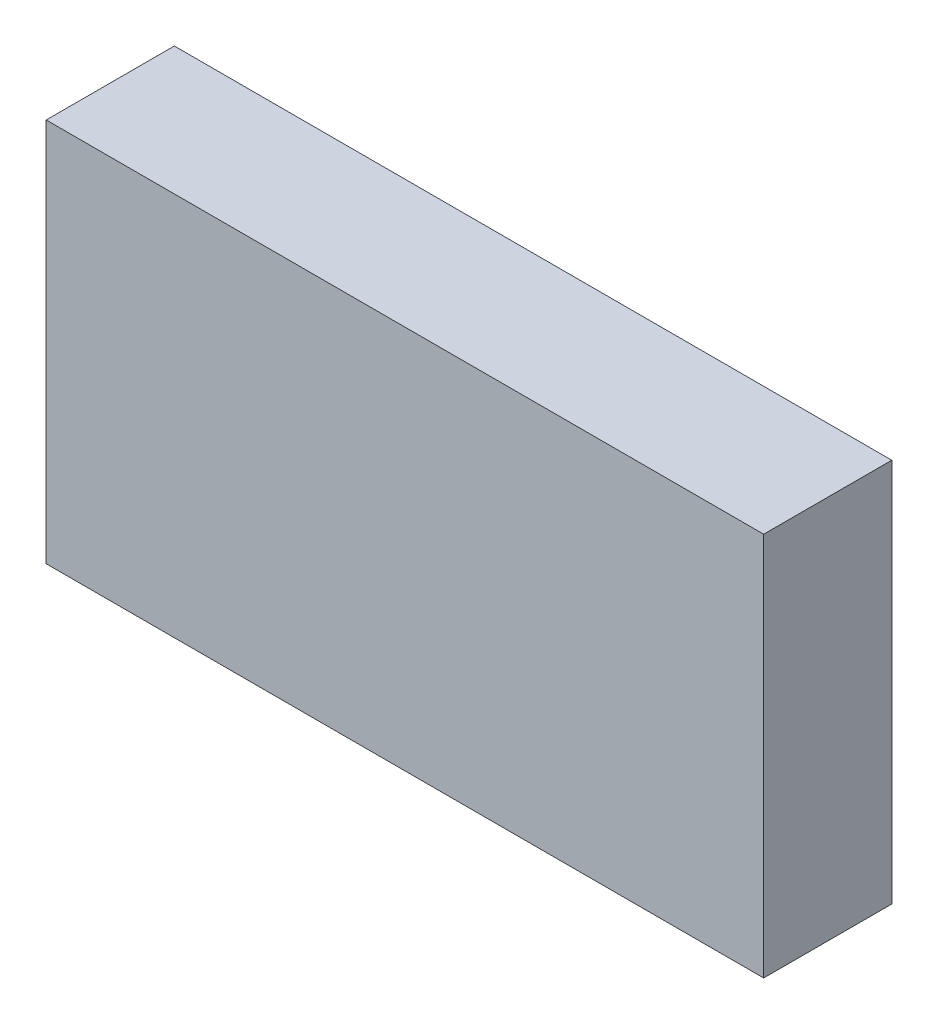
ISO-10303-21;
HEADER;
FILE_DESCRIPTION(('STEP AP214'),'2;1');
FILE_NAME('part.step','',(''),(''),'','','');
FILE_SCHEMA(('AUTOMOTIVE_DESIGN { 1 0 10303 214 1 1 1 1 }'));
ENDSEC;
DATA;
#1=APPLICATION_CONTEXT('core data for automotive mechanical design processes');
#2=APPLICATION_PROTOCOL_DEFINITION('international standard','automotive_design',2000,#1);
#3=PRODUCT_CONTEXT('',#1,'mechanical');
#4=PRODUCT('Part','Part','',(#3));
#5=PRODUCT_RELATED_PRODUCT_CATEGORY('part','',(#4));
#6=PRODUCT_DEFINITION_FORMATION('','',#4);
#7=PRODUCT_DEFINITION_CONTEXT('part definition',#1,'design');
#8=PRODUCT_DEFINITION('design','',#6,#7);
#9=PRODUCT_DEFINITION_SHAPE('','',#8);
#10=(LENGTH_UNIT() NAMED_UNIT(*) SI_UNIT(.MILLI.,.METRE.));
#11=(NAMED_UNIT(*) PLANE_ANGLE_UNIT() SI_UNIT($,.RADIAN.));
#12=(NAMED_UNIT(*) SI_UNIT($,.STERADIAN.) SOLID_ANGLE_UNIT());
#13=UNCERTAINTY_MEASURE_WITH_UNIT(LENGTH_MEASURE(1.E-05),#10,'distance_accuracy_value','');
#14=(GEOMETRIC_REPRESENTATION_CONTEXT(3) GLOBAL_UNCERTAINTY_ASSIGNED_CONTEXT((#13)) GLOBAL_UNIT_ASSIGNED_CONTEXT((#10,
#11,#12)) REPRESENTATION_CONTEXT('',''));
#15=CARTESIAN_POINT('',(0.,0.,0.));
#16=DIRECTION('',(0.,0.,1.));
#17=DIRECTION('',(1.,0.,0.));
#18=AXIS2_PLACEMENT_3D('',#15,#16,#17);
#19=CARTESIAN_POINT('',(-28.7082094376212,15.5294117647059,10.));
#20=DIRECTION('',(1.,0.,0.));
#21=DIRECTION('',(0.,0.,-1.));
#22=AXIS2_PLACEMENT_3D('',#19,#20,#21);
#23=PLANE('',#22);
#24=DIRECTION('',(0.,-1.,0.));
#25=VECTOR('',#24,1.);
#26=CARTESIAN_POINT('',(-28.7082094376212,15.5294117647059,0.));
#27=LINE('',#26,#25);
#28=CARTESIAN_POINT('',(-28.7082094376212,15.5294117647059,0.));
#29=VERTEX_POINT('',#28);
#30=CARTESIAN_POINT('',(-28.7082094376212,-14.4705882352941,0.));
#31=VERTEX_POINT('',#30);
#32=EDGE_CURVE('E115',#29,#31,#27,.T.);
#33=ORIENTED_EDGE('',*,*,#32,.T.);
#34=DIRECTION('',(0.,0.,-1.));
#35=VECTOR('',#34,1.);
#36=CARTESIAN_POINT('',(-28.7082094376212,-14.4705882352941,10.));
#37=LINE('',#36,#35);
#38=CARTESIAN_POINT('',(-28.7082094376212,-14.4705882352941,10.));
#39=VERTEX_POINT('',#38);
#40=EDGE_CURVE('E11',#39,#31,#37,.T.);
#41=ORIENTED_EDGE('',*,*,#40,.F.);
#42=DIRECTION('',(0.,-1.,0.));
#43=VECTOR('',#42,1.);
#44=CARTESIAN_POINT('',(-28.7082094376212,15.5294117647059,10.));
#45=LINE('',#44,#43);
#46=CARTESIAN_POINT('',(-28.7082094376212,15.5294117647059,10.));
#47=VERTEX_POINT('',#46);
#48=EDGE_CURVE('E94',#47,#39,#45,.T.);
#49=ORIENTED_EDGE('',*,*,#48,.F.);
#50=DIRECTION('',(0.,0.,-1.));
#51=VECTOR('',#50,1.);
#52=CARTESIAN_POINT('',(-28.7082094376212,15.5294117647059,10.));
#53=LINE('',#52,#51);
#54=EDGE_CURVE('E110',#47,#29,#53,.T.);
#55=ORIENTED_EDGE('',*,*,#54,.T.);
#56=EDGE_LOOP('',(#33,#41,#49,#55));
#57=FACE_BOUND('',#56,.T.);
#58=ADVANCED_FACE('F43',(#57),#23,.F.);
#59=CARTESIAN_POINT('',(-28.7082094376212,-14.4705882352941,10.));
#60=DIRECTION('',(0.,1.,0.));
#61=DIRECTION('',(0.,0.,1.));
#62=AXIS2_PLACEMENT_3D('',#59,#60,#61);
#63=PLANE('',#62);
#64=DIRECTION('',(1.,0.,0.));
#65=VECTOR('',#64,1.);
#66=CARTESIAN_POINT('',(-28.7082094376212,-14.4705882352941,0.));
#67=LINE('',#66,#65);
#68=CARTESIAN_POINT('',(27.2917905623788,-14.4705882352941,0.));
#69=VERTEX_POINT('',#68);
#70=EDGE_CURVE('E99',#31,#69,#67,.T.);
#71=ORIENTED_EDGE('',*,*,#70,.T.);
#72=DIRECTION('',(0.,0.,-1.));
#73=VECTOR('',#72,1.);
#74=CARTESIAN_POINT('',(27.2917905623788,-14.4705882352941,10.));
#75=LINE('',#74,#73);
#76=CARTESIAN_POINT('',(27.2917905623788,-14.4705882352941,10.));
#77=VERTEX_POINT('',#76);
#78=EDGE_CURVE('E55',#77,#69,#75,.T.);
#79=ORIENTED_EDGE('',*,*,#78,.F.);
#80=DIRECTION('',(1.,0.,0.));
#81=VECTOR('',#80,1.);
#82=CARTESIAN_POINT('',(-28.7082094376212,-14.4705882352941,10.));
#83=LINE('',#82,#81);
#84=EDGE_CURVE('E89',#39,#77,#83,.T.);
#85=ORIENTED_EDGE('',*,*,#84,.F.);
#86=ORIENTED_EDGE('',*,*,#40,.T.);
#87=EDGE_LOOP('',(#71,#79,#85,#86));
#88=FACE_BOUND('',#87,.T.);
#89=ADVANCED_FACE('F98',(#88),#63,.F.);
#90=CARTESIAN_POINT('',(27.2917905623788,15.5294117647059,10.));
#91=DIRECTION('',(-1.,0.,0.));
#92=DIRECTION('',(0.,-1.,0.));
#93=AXIS2_PLACEMENT_3D('',#90,#91,#92);
#94=PLANE('',#93);
#95=DIRECTION('',(0.,1.,0.));
#96=VECTOR('',#95,1.);
#97=CARTESIAN_POINT('',(27.2917905623788,15.5294117647059,0.));
#98=LINE('',#97,#96);
#99=CARTESIAN_POINT('',(27.2917905623788,15.5294117647059,0.));
#100=VERTEX_POINT('',#99);
#101=EDGE_CURVE('E77',#69,#100,#98,.T.);
#102=ORIENTED_EDGE('',*,*,#101,.T.);
#103=DIRECTION('',(0.,0.,-1.));
#104=VECTOR('',#103,1.);
#105=CARTESIAN_POINT('',(27.2917905623788,15.5294117647059,10.));
#106=LINE('',#105,#104);
#107=CARTESIAN_POINT('',(27.2917905623788,15.5294117647059,10.));
#108=VERTEX_POINT('',#107);
#109=EDGE_CURVE('E105',#108,#100,#106,.T.);
#110=ORIENTED_EDGE('',*,*,#109,.F.);
#111=DIRECTION('',(0.,1.,0.));
#112=VECTOR('',#111,1.);
#113=CARTESIAN_POINT('',(27.2917905623788,15.5294117647059,10.));
#114=LINE('',#113,#112);
#115=EDGE_CURVE('E93',#77,#108,#114,.T.);
#116=ORIENTED_EDGE('',*,*,#115,.F.);
#117=ORIENTED_EDGE('',*,*,#78,.T.);
#118=EDGE_LOOP('',(#102,#110,#116,#117));
#119=FACE_BOUND('',#118,.T.);
#120=ADVANCED_FACE('F104',(#119),#94,.F.);
#121=CARTESIAN_POINT('',(-28.7082094376212,15.5294117647059,10.));
#122=DIRECTION('',(0.,-1.,0.));
#123=DIRECTION('',(1.,0.,0.));
#124=AXIS2_PLACEMENT_3D('',#121,#122,#123);
#125=PLANE('',#124);
#126=DIRECTION('',(-1.,0.,0.));
#127=VECTOR('',#126,1.);
#128=CARTESIAN_POINT('',(-28.7082094376212,15.5294117647059,0.));
#129=LINE('',#128,#127);
#130=EDGE_CURVE('E81',#100,#29,#129,.T.);
#131=ORIENTED_EDGE('',*,*,#130,.T.);
#132=ORIENTED_EDGE('',*,*,#54,.F.);
#133=DIRECTION('',(-1.,0.,0.));
#134=VECTOR('',#133,1.);
#135=CARTESIAN_POINT('',(-28.7082094376212,15.5294117647059,10.));
#136=LINE('',#135,#134);
#137=EDGE_CURVE('E58',#108,#47,#136,.T.);
#138=ORIENTED_EDGE('',*,*,#137,.F.);
#139=ORIENTED_EDGE('',*,*,#109,.T.);
#140=EDGE_LOOP('',(#131,#132,#138,#139));
#141=FACE_BOUND('',#140,.T.);
#142=ADVANCED_FACE('F128',(#141),#125,.F.);
#143=CARTESIAN_POINT('',(0.,0.,10.));
#144=DIRECTION('',(0.,0.,1.));
#145=DIRECTION('',(1.,0.,0.));
#146=AXIS2_PLACEMENT_3D('',#143,#144,#145);
#147=PLANE('',#146);
#148=ORIENTED_EDGE('',*,*,#48,.T.);
#149=ORIENTED_EDGE('',*,*,#84,.T.);
#150=ORIENTED_EDGE('',*,*,#115,.T.);
#151=ORIENTED_EDGE('',*,*,#137,.T.);
#152=EDGE_LOOP('',(#148,#149,#150,#151));
#153=FACE_BOUND('',#152,.T.);
#154=ADVANCED_FACE('F91',(#153),#147,.T.);
#155=CARTESIAN_POINT('',(0.,0.,0.));
#156=DIRECTION('',(0.,0.,1.));
#157=DIRECTION('',(1.,0.,0.));
#158=AXIS2_PLACEMENT_3D('',#155,#156,#157);
#159=PLANE('',#158);
#160=ORIENTED_EDGE('',*,*,#32,.F.);
#161=ORIENTED_EDGE('',*,*,#130,.F.);
#162=ORIENTED_EDGE('',*,*,#101,.F.);
#163=ORIENTED_EDGE('',*,*,#70,.F.);
#164=EDGE_LOOP('',(#160,#161,#162,#163));
#165=FACE_BOUND('',#164,.T.);
#166=ADVANCED_FACE('F129',(#165),#159,.F.);
#167=CLOSED_SHELL('',(#58,#89,#120,#142,#154,#166));
#168=MANIFOLD_SOLID_BREP('B2',#167);
#169=ADVANCED_BREP_SHAPE_REPRESENTATION('',(#18,#168),#14);
#170=SHAPE_DEFINITION_REPRESENTATION(#9,#169);
ENDSEC;
END-ISO-10303-21;
